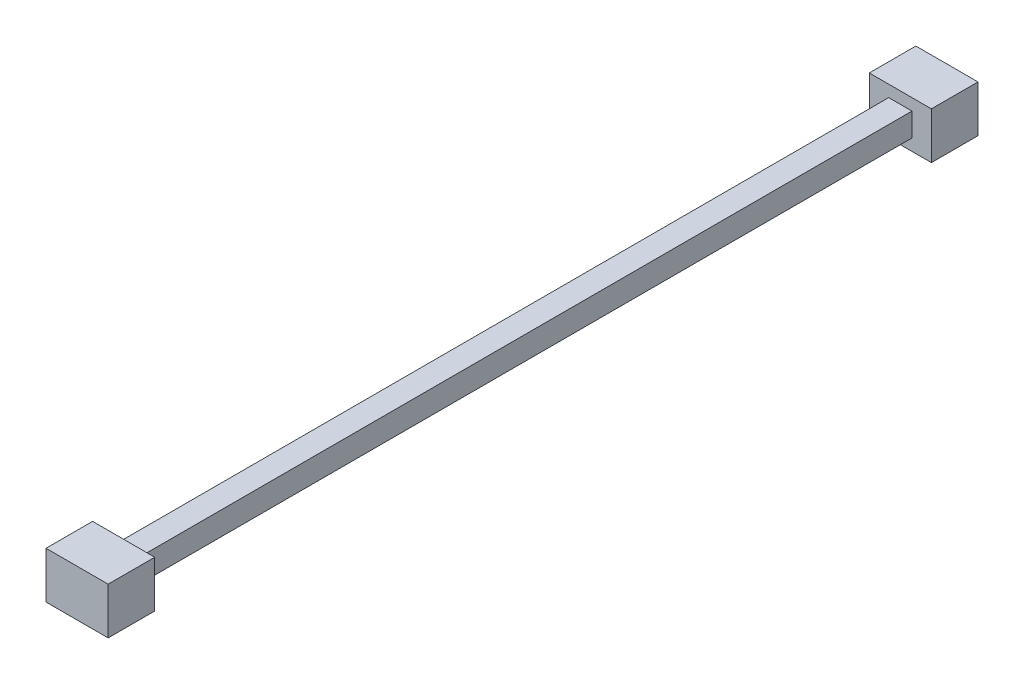
ISO-10303-21;
HEADER;
FILE_DESCRIPTION(('STEP AP214'),'2;1');
FILE_NAME('part.step','',(''),(''),'','','');
FILE_SCHEMA(('AUTOMOTIVE_DESIGN { 1 0 10303 214 1 1 1 1 }'));
ENDSEC;
DATA;
#1=APPLICATION_CONTEXT('core data for automotive mechanical design processes');
#2=APPLICATION_PROTOCOL_DEFINITION('international standard','automotive_design',2000,#1);
#3=PRODUCT_CONTEXT('',#1,'mechanical');
#4=PRODUCT('Part','Part','',(#3));
#5=PRODUCT_RELATED_PRODUCT_CATEGORY('part','',(#4));
#6=PRODUCT_DEFINITION_FORMATION('','',#4);
#7=PRODUCT_DEFINITION_CONTEXT('part definition',#1,'design');
#8=PRODUCT_DEFINITION('design','',#6,#7);
#9=PRODUCT_DEFINITION_SHAPE('','',#8);
#10=(LENGTH_UNIT() NAMED_UNIT(*) SI_UNIT(.MILLI.,.METRE.));
#11=(NAMED_UNIT(*) PLANE_ANGLE_UNIT() SI_UNIT($,.RADIAN.));
#12=(NAMED_UNIT(*) SI_UNIT($,.STERADIAN.) SOLID_ANGLE_UNIT());
#13=UNCERTAINTY_MEASURE_WITH_UNIT(LENGTH_MEASURE(1.E-05),#10,'distance_accuracy_value','');
#14=(GEOMETRIC_REPRESENTATION_CONTEXT(3) GLOBAL_UNCERTAINTY_ASSIGNED_CONTEXT((#13)) GLOBAL_UNIT_ASSIGNED_CONTEXT((#10,
#11,#12)) REPRESENTATION_CONTEXT('',''));
#15=CARTESIAN_POINT('',(0.,0.,0.));
#16=DIRECTION('',(0.,0.,1.));
#17=DIRECTION('',(1.,0.,0.));
#18=AXIS2_PLACEMENT_3D('',#15,#16,#17);
#19=CARTESIAN_POINT('',(7.5,-7.5,500.));
#20=DIRECTION('',(-1.,0.,0.));
#21=DIRECTION('',(0.,0.,1.));
#22=AXIS2_PLACEMENT_3D('',#19,#20,#21);
#23=PLANE('',#22);
#24=DIRECTION('',(0.,1.,0.));
#25=VECTOR('',#24,1.);
#26=CARTESIAN_POINT('',(7.5,-7.5,0.));
#27=LINE('',#26,#25);
#28=CARTESIAN_POINT('',(7.5,-7.5,0.));
#29=VERTEX_POINT('',#28);
#30=CARTESIAN_POINT('',(7.5,7.5,0.));
#31=VERTEX_POINT('',#30);
#32=EDGE_CURVE('E182',#29,#31,#27,.T.);
#33=ORIENTED_EDGE('',*,*,#32,.T.);
#34=DIRECTION('',(0.,0.,-1.));
#35=VECTOR('',#34,1.);
#36=CARTESIAN_POINT('',(7.5,7.5,500.));
#37=LINE('',#36,#35);
#38=CARTESIAN_POINT('',(7.5,7.5,500.));
#39=VERTEX_POINT('',#38);
#40=EDGE_CURVE('E11',#39,#31,#37,.T.);
#41=ORIENTED_EDGE('',*,*,#40,.F.);
#42=DIRECTION('',(0.,1.,0.));
#43=VECTOR('',#42,1.);
#44=CARTESIAN_POINT('',(7.5,-7.5,500.));
#45=LINE('',#44,#43);
#46=CARTESIAN_POINT('',(7.5,-7.5,500.));
#47=VERTEX_POINT('',#46);
#48=EDGE_CURVE('E183',#47,#39,#45,.T.);
#49=ORIENTED_EDGE('',*,*,#48,.F.);
#50=DIRECTION('',(0.,0.,-1.));
#51=VECTOR('',#50,1.);
#52=CARTESIAN_POINT('',(7.5,-7.5,500.));
#53=LINE('',#52,#51);
#54=EDGE_CURVE('E196',#47,#29,#53,.T.);
#55=ORIENTED_EDGE('',*,*,#54,.T.);
#56=EDGE_LOOP('',(#33,#41,#49,#55));
#57=FACE_BOUND('',#56,.T.);
#58=ADVANCED_FACE('F37',(#57),#23,.F.);
#59=CARTESIAN_POINT('',(-7.5,7.5,500.));
#60=DIRECTION('',(0.,-1.,0.));
#61=DIRECTION('',(0.,0.,-1.));
#62=AXIS2_PLACEMENT_3D('',#59,#60,#61);
#63=PLANE('',#62);
#64=DIRECTION('',(-1.,0.,0.));
#65=VECTOR('',#64,1.);
#66=CARTESIAN_POINT('',(-7.5,7.5,0.));
#67=LINE('',#66,#65);
#68=CARTESIAN_POINT('',(-7.5,7.5,0.));
#69=VERTEX_POINT('',#68);
#70=EDGE_CURVE('E199',#31,#69,#67,.T.);
#71=ORIENTED_EDGE('',*,*,#70,.T.);
#72=DIRECTION('',(0.,0.,-1.));
#73=VECTOR('',#72,1.);
#74=CARTESIAN_POINT('',(-7.5,7.5,500.));
#75=LINE('',#74,#73);
#76=CARTESIAN_POINT('',(-7.5,7.5,500.));
#77=VERTEX_POINT('',#76);
#78=EDGE_CURVE('E45',#77,#69,#75,.T.);
#79=ORIENTED_EDGE('',*,*,#78,.F.);
#80=DIRECTION('',(-1.,0.,0.));
#81=VECTOR('',#80,1.);
#82=CARTESIAN_POINT('',(-7.5,7.5,500.));
#83=LINE('',#82,#81);
#84=EDGE_CURVE('E186',#39,#77,#83,.T.);
#85=ORIENTED_EDGE('',*,*,#84,.F.);
#86=ORIENTED_EDGE('',*,*,#40,.T.);
#87=EDGE_LOOP('',(#71,#79,#85,#86));
#88=FACE_BOUND('',#87,.T.);
#89=ADVANCED_FACE('F212',(#88),#63,.F.);
#90=CARTESIAN_POINT('',(-7.5,-7.5,500.));
#91=DIRECTION('',(1.,0.,0.));
#92=DIRECTION('',(0.,0.,-1.));
#93=AXIS2_PLACEMENT_3D('',#90,#91,#92);
#94=PLANE('',#93);
#95=DIRECTION('',(0.,-1.,0.));
#96=VECTOR('',#95,1.);
#97=CARTESIAN_POINT('',(-7.5,-7.5,0.));
#98=LINE('',#97,#96);
#99=CARTESIAN_POINT('',(-7.5,-7.5,0.));
#100=VERTEX_POINT('',#99);
#101=EDGE_CURVE('E202',#69,#100,#98,.T.);
#102=ORIENTED_EDGE('',*,*,#101,.T.);
#103=DIRECTION('',(0.,0.,-1.));
#104=VECTOR('',#103,1.);
#105=CARTESIAN_POINT('',(-7.5,-7.5,500.));
#106=LINE('',#105,#104);
#107=CARTESIAN_POINT('',(-7.5,-7.5,500.));
#108=VERTEX_POINT('',#107);
#109=EDGE_CURVE('E52',#108,#100,#106,.T.);
#110=ORIENTED_EDGE('',*,*,#109,.F.);
#111=DIRECTION('',(0.,-1.,0.));
#112=VECTOR('',#111,1.);
#113=CARTESIAN_POINT('',(-7.5,-7.5,500.));
#114=LINE('',#113,#112);
#115=EDGE_CURVE('E190',#77,#108,#114,.T.);
#116=ORIENTED_EDGE('',*,*,#115,.F.);
#117=ORIENTED_EDGE('',*,*,#78,.T.);
#118=EDGE_LOOP('',(#102,#110,#116,#117));
#119=FACE_BOUND('',#118,.T.);
#120=ADVANCED_FACE('F209',(#119),#94,.F.);
#121=CARTESIAN_POINT('',(-7.5,-7.5,500.));
#122=DIRECTION('',(0.,1.,0.));
#123=DIRECTION('',(0.,0.,1.));
#124=AXIS2_PLACEMENT_3D('',#121,#122,#123);
#125=PLANE('',#124);
#126=DIRECTION('',(1.,0.,0.));
#127=VECTOR('',#126,1.);
#128=CARTESIAN_POINT('',(-7.5,-7.5,0.));
#129=LINE('',#128,#127);
#130=EDGE_CURVE('E187',#100,#29,#129,.T.);
#131=ORIENTED_EDGE('',*,*,#130,.T.);
#132=ORIENTED_EDGE('',*,*,#54,.F.);
#133=DIRECTION('',(1.,0.,0.));
#134=VECTOR('',#133,1.);
#135=CARTESIAN_POINT('',(-7.5,-7.5,500.));
#136=LINE('',#135,#134);
#137=EDGE_CURVE('E193',#108,#47,#136,.T.);
#138=ORIENTED_EDGE('',*,*,#137,.F.);
#139=ORIENTED_EDGE('',*,*,#109,.T.);
#140=EDGE_LOOP('',(#131,#132,#138,#139));
#141=FACE_BOUND('',#140,.T.);
#142=ADVANCED_FACE('F219',(#141),#125,.F.);
#143=CARTESIAN_POINT('',(20.,-15.,530.));
#144=DIRECTION('',(-1.,0.,0.));
#145=DIRECTION('',(0.,0.,1.));
#146=AXIS2_PLACEMENT_3D('',#143,#144,#145);
#147=PLANE('',#146);
#148=DIRECTION('',(0.,1.,0.));
#149=VECTOR('',#148,1.);
#150=CARTESIAN_POINT('',(20.,-15.,500.));
#151=LINE('',#150,#149);
#152=CARTESIAN_POINT('',(20.,-15.,500.));
#153=VERTEX_POINT('',#152);
#154=CARTESIAN_POINT('',(20.,15.,500.));
#155=VERTEX_POINT('',#154);
#156=EDGE_CURVE('E147',#153,#155,#151,.T.);
#157=ORIENTED_EDGE('',*,*,#156,.T.);
#158=DIRECTION('',(0.,0.,-1.));
#159=VECTOR('',#158,1.);
#160=CARTESIAN_POINT('',(20.,15.,530.));
#161=LINE('',#160,#159);
#162=CARTESIAN_POINT('',(20.,15.,530.));
#163=VERTEX_POINT('',#162);
#164=EDGE_CURVE('E179',#163,#155,#161,.T.);
#165=ORIENTED_EDGE('',*,*,#164,.F.);
#166=DIRECTION('',(0.,1.,0.));
#167=VECTOR('',#166,1.);
#168=CARTESIAN_POINT('',(20.,-15.,530.));
#169=LINE('',#168,#167);
#170=CARTESIAN_POINT('',(20.,-15.,530.));
#171=VERTEX_POINT('',#170);
#172=EDGE_CURVE('E156',#171,#163,#169,.T.);
#173=ORIENTED_EDGE('',*,*,#172,.F.);
#174=DIRECTION('',(0.,0.,-1.));
#175=VECTOR('',#174,1.);
#176=CARTESIAN_POINT('',(20.,-15.,530.));
#177=LINE('',#176,#175);
#178=EDGE_CURVE('E165',#171,#153,#177,.T.);
#179=ORIENTED_EDGE('',*,*,#178,.T.);
#180=EDGE_LOOP('',(#157,#165,#173,#179));
#181=FACE_BOUND('',#180,.T.);
#182=ADVANCED_FACE('F232',(#181),#147,.F.);
#183=CARTESIAN_POINT('',(-20.,15.,530.));
#184=DIRECTION('',(0.,-1.,0.));
#185=DIRECTION('',(0.,0.,-1.));
#186=AXIS2_PLACEMENT_3D('',#183,#184,#185);
#187=PLANE('',#186);
#188=DIRECTION('',(-1.,0.,0.));
#189=VECTOR('',#188,1.);
#190=CARTESIAN_POINT('',(-20.,15.,500.));
#191=LINE('',#190,#189);
#192=CARTESIAN_POINT('',(-20.,15.,500.));
#193=VERTEX_POINT('',#192);
#194=EDGE_CURVE('E150',#155,#193,#191,.T.);
#195=ORIENTED_EDGE('',*,*,#194,.T.);
#196=DIRECTION('',(0.,0.,-1.));
#197=VECTOR('',#196,1.);
#198=CARTESIAN_POINT('',(-20.,15.,530.));
#199=LINE('',#198,#197);
#200=CARTESIAN_POINT('',(-20.,15.,530.));
#201=VERTEX_POINT('',#200);
#202=EDGE_CURVE('E176',#201,#193,#199,.T.);
#203=ORIENTED_EDGE('',*,*,#202,.F.);
#204=DIRECTION('',(-1.,0.,0.));
#205=VECTOR('',#204,1.);
#206=CARTESIAN_POINT('',(-20.,15.,530.));
#207=LINE('',#206,#205);
#208=EDGE_CURVE('E159',#163,#201,#207,.T.);
#209=ORIENTED_EDGE('',*,*,#208,.F.);
#210=ORIENTED_EDGE('',*,*,#164,.T.);
#211=EDGE_LOOP('',(#195,#203,#209,#210));
#212=FACE_BOUND('',#211,.T.);
#213=ADVANCED_FACE('F244',(#212),#187,.F.);
#214=CARTESIAN_POINT('',(-20.,-15.,530.));
#215=DIRECTION('',(1.,0.,0.));
#216=DIRECTION('',(0.,0.,-1.));
#217=AXIS2_PLACEMENT_3D('',#214,#215,#216);
#218=PLANE('',#217);
#219=DIRECTION('',(0.,-1.,0.));
#220=VECTOR('',#219,1.);
#221=CARTESIAN_POINT('',(-20.,-15.,500.));
#222=LINE('',#221,#220);
#223=CARTESIAN_POINT('',(-20.,-15.,500.));
#224=VERTEX_POINT('',#223);
#225=EDGE_CURVE('E168',#193,#224,#222,.T.);
#226=ORIENTED_EDGE('',*,*,#225,.T.);
#227=DIRECTION('',(0.,0.,-1.));
#228=VECTOR('',#227,1.);
#229=CARTESIAN_POINT('',(-20.,-15.,530.));
#230=LINE('',#229,#228);
#231=CARTESIAN_POINT('',(-20.,-15.,530.));
#232=VERTEX_POINT('',#231);
#233=EDGE_CURVE('E173',#232,#224,#230,.T.);
#234=ORIENTED_EDGE('',*,*,#233,.F.);
#235=DIRECTION('',(0.,-1.,0.));
#236=VECTOR('',#235,1.);
#237=CARTESIAN_POINT('',(-20.,-15.,530.));
#238=LINE('',#237,#236);
#239=EDGE_CURVE('E162',#201,#232,#238,.T.);
#240=ORIENTED_EDGE('',*,*,#239,.F.);
#241=ORIENTED_EDGE('',*,*,#202,.T.);
#242=EDGE_LOOP('',(#226,#234,#240,#241));
#243=FACE_BOUND('',#242,.T.);
#244=ADVANCED_FACE('F241',(#243),#218,.F.);
#245=CARTESIAN_POINT('',(-20.,-15.,530.));
#246=DIRECTION('',(0.,1.,0.));
#247=DIRECTION('',(0.,0.,1.));
#248=AXIS2_PLACEMENT_3D('',#245,#246,#247);
#249=PLANE('',#248);
#250=DIRECTION('',(1.,0.,0.));
#251=VECTOR('',#250,1.);
#252=CARTESIAN_POINT('',(-20.,-15.,500.));
#253=LINE('',#252,#251);
#254=EDGE_CURVE('E160',#224,#153,#253,.T.);
#255=ORIENTED_EDGE('',*,*,#254,.T.);
#256=ORIENTED_EDGE('',*,*,#178,.F.);
#257=DIRECTION('',(1.,0.,0.));
#258=VECTOR('',#257,1.);
#259=CARTESIAN_POINT('',(-20.,-15.,530.));
#260=LINE('',#259,#258);
#261=EDGE_CURVE('E164',#232,#171,#260,.T.);
#262=ORIENTED_EDGE('',*,*,#261,.F.);
#263=ORIENTED_EDGE('',*,*,#233,.T.);
#264=EDGE_LOOP('',(#255,#256,#262,#263));
#265=FACE_BOUND('',#264,.T.);
#266=ADVANCED_FACE('F237',(#265),#249,.F.);
#267=CARTESIAN_POINT('',(0.,0.,530.));
#268=DIRECTION('',(0.,0.,-1.));
#269=DIRECTION('',(-1.,0.,0.));
#270=AXIS2_PLACEMENT_3D('',#267,#268,#269);
#271=PLANE('',#270);
#272=ORIENTED_EDGE('',*,*,#172,.T.);
#273=ORIENTED_EDGE('',*,*,#208,.T.);
#274=ORIENTED_EDGE('',*,*,#239,.T.);
#275=ORIENTED_EDGE('',*,*,#261,.T.);
#276=EDGE_LOOP('',(#272,#273,#274,#275));
#277=FACE_BOUND('',#276,.T.);
#278=ADVANCED_FACE('F225',(#277),#271,.F.);
#279=CARTESIAN_POINT('',(0.,0.,500.));
#280=DIRECTION('',(0.,0.,-1.));
#281=DIRECTION('',(-1.,0.,0.));
#282=AXIS2_PLACEMENT_3D('',#279,#280,#281);
#283=PLANE('',#282);
#284=ORIENTED_EDGE('',*,*,#137,.T.);
#285=ORIENTED_EDGE('',*,*,#48,.T.);
#286=ORIENTED_EDGE('',*,*,#84,.T.);
#287=ORIENTED_EDGE('',*,*,#115,.T.);
#288=EDGE_LOOP('',(#284,#285,#286,#287));
#289=FACE_BOUND('',#288,.T.);
#290=ORIENTED_EDGE('',*,*,#156,.F.);
#291=ORIENTED_EDGE('',*,*,#254,.F.);
#292=ORIENTED_EDGE('',*,*,#225,.F.);
#293=ORIENTED_EDGE('',*,*,#194,.F.);
#294=EDGE_LOOP('',(#290,#291,#292,#293));
#295=FACE_BOUND('',#294,.T.);
#296=ADVANCED_FACE('F222',(#289,#295),#283,.T.);
#297=CARTESIAN_POINT('',(-20.,15.,-30.));
#298=DIRECTION('',(1.,0.,0.));
#299=DIRECTION('',(0.,1.,0.));
#300=AXIS2_PLACEMENT_3D('',#297,#298,#299);
#301=PLANE('',#300);
#302=DIRECTION('',(0.,1.,0.));
#303=VECTOR('',#302,1.);
#304=CARTESIAN_POINT('',(-20.,15.,0.));
#305=LINE('',#304,#303);
#306=CARTESIAN_POINT('',(-20.,-15.,0.));
#307=VERTEX_POINT('',#306);
#308=CARTESIAN_POINT('',(-20.,15.,0.));
#309=VERTEX_POINT('',#308);
#310=EDGE_CURVE('E146',#307,#309,#305,.T.);
#311=ORIENTED_EDGE('',*,*,#310,.T.);
#312=DIRECTION('',(0.,0.,1.));
#313=VECTOR('',#312,1.);
#314=CARTESIAN_POINT('',(-20.,15.,-30.));
#315=LINE('',#314,#313);
#316=CARTESIAN_POINT('',(-20.,15.,-30.));
#317=VERTEX_POINT('',#316);
#318=EDGE_CURVE('E126',#317,#309,#315,.T.);
#319=ORIENTED_EDGE('',*,*,#318,.F.);
#320=DIRECTION('',(0.,1.,0.));
#321=VECTOR('',#320,1.);
#322=CARTESIAN_POINT('',(-20.,15.,-30.));
#323=LINE('',#322,#321);
#324=CARTESIAN_POINT('',(-20.,-15.,-30.));
#325=VERTEX_POINT('',#324);
#326=EDGE_CURVE('E133',#325,#317,#323,.T.);
#327=ORIENTED_EDGE('',*,*,#326,.F.);
#328=DIRECTION('',(0.,0.,1.));
#329=VECTOR('',#328,1.);
#330=CARTESIAN_POINT('',(-20.,-15.,-30.));
#331=LINE('',#330,#329);
#332=EDGE_CURVE('E367',#325,#307,#331,.T.);
#333=ORIENTED_EDGE('',*,*,#332,.T.);
#334=EDGE_LOOP('',(#311,#319,#327,#333));
#335=FACE_BOUND('',#334,.T.);
#336=ADVANCED_FACE('F144',(#335),#301,.F.);
#337=CARTESIAN_POINT('',(20.,15.,-30.));
#338=DIRECTION('',(0.,-1.,0.));
#339=DIRECTION('',(0.,0.,-1.));
#340=AXIS2_PLACEMENT_3D('',#337,#338,#339);
#341=PLANE('',#340);
#342=DIRECTION('',(1.,0.,0.));
#343=VECTOR('',#342,1.);
#344=CARTESIAN_POINT('',(20.,15.,0.));
#345=LINE('',#344,#343);
#346=CARTESIAN_POINT('',(20.,15.,0.));
#347=VERTEX_POINT('',#346);
#348=EDGE_CURVE('E373',#309,#347,#345,.T.);
#349=ORIENTED_EDGE('',*,*,#348,.T.);
#350=DIRECTION('',(0.,0.,1.));
#351=VECTOR('',#350,1.);
#352=CARTESIAN_POINT('',(20.,15.,-30.));
#353=LINE('',#352,#351);
#354=CARTESIAN_POINT('',(20.,15.,-30.));
#355=VERTEX_POINT('',#354);
#356=EDGE_CURVE('E129',#355,#347,#353,.T.);
#357=ORIENTED_EDGE('',*,*,#356,.F.);
#358=DIRECTION('',(1.,0.,0.));
#359=VECTOR('',#358,1.);
#360=CARTESIAN_POINT('',(20.,15.,-30.));
#361=LINE('',#360,#359);
#362=EDGE_CURVE('E122',#317,#355,#361,.T.);
#363=ORIENTED_EDGE('',*,*,#362,.F.);
#364=ORIENTED_EDGE('',*,*,#318,.T.);
#365=EDGE_LOOP('',(#349,#357,#363,#364));
#366=FACE_BOUND('',#365,.T.);
#367=ADVANCED_FACE('F124',(#366),#341,.F.);
#368=CARTESIAN_POINT('',(20.,15.,-30.));
#369=DIRECTION('',(-1.,0.,0.));
#370=DIRECTION('',(0.,-1.,0.));
#371=AXIS2_PLACEMENT_3D('',#368,#369,#370);
#372=PLANE('',#371);
#373=DIRECTION('',(0.,-1.,0.));
#374=VECTOR('',#373,1.);
#375=CARTESIAN_POINT('',(20.,15.,0.));
#376=LINE('',#375,#374);
#377=CARTESIAN_POINT('',(20.,-15.,0.));
#378=VERTEX_POINT('',#377);
#379=EDGE_CURVE('E370',#347,#378,#376,.T.);
#380=ORIENTED_EDGE('',*,*,#379,.T.);
#381=DIRECTION('',(0.,0.,1.));
#382=VECTOR('',#381,1.);
#383=CARTESIAN_POINT('',(20.,-15.,-30.));
#384=LINE('',#383,#382);
#385=CARTESIAN_POINT('',(20.,-15.,-30.));
#386=VERTEX_POINT('',#385);
#387=EDGE_CURVE('E152',#386,#378,#384,.T.);
#388=ORIENTED_EDGE('',*,*,#387,.F.);
#389=DIRECTION('',(0.,-1.,0.));
#390=VECTOR('',#389,1.);
#391=CARTESIAN_POINT('',(20.,15.,-30.));
#392=LINE('',#391,#390);
#393=EDGE_CURVE('E132',#355,#386,#392,.T.);
#394=ORIENTED_EDGE('',*,*,#393,.F.);
#395=ORIENTED_EDGE('',*,*,#356,.T.);
#396=EDGE_LOOP('',(#380,#388,#394,#395));
#397=FACE_BOUND('',#396,.T.);
#398=ADVANCED_FACE('F326',(#397),#372,.F.);
#399=CARTESIAN_POINT('',(20.,-15.,-30.));
#400=DIRECTION('',(0.,1.,0.));
#401=DIRECTION('',(0.,0.,1.));
#402=AXIS2_PLACEMENT_3D('',#399,#400,#401);
#403=PLANE('',#402);
#404=DIRECTION('',(-1.,0.,0.));
#405=VECTOR('',#404,1.);
#406=CARTESIAN_POINT('',(20.,-15.,0.));
#407=LINE('',#406,#405);
#408=EDGE_CURVE('E142',#378,#307,#407,.T.);
#409=ORIENTED_EDGE('',*,*,#408,.T.);
#410=ORIENTED_EDGE('',*,*,#332,.F.);
#411=DIRECTION('',(-1.,0.,0.));
#412=VECTOR('',#411,1.);
#413=CARTESIAN_POINT('',(20.,-15.,-30.));
#414=LINE('',#413,#412);
#415=EDGE_CURVE('E138',#386,#325,#414,.T.);
#416=ORIENTED_EDGE('',*,*,#415,.F.);
#417=ORIENTED_EDGE('',*,*,#387,.T.);
#418=EDGE_LOOP('',(#409,#410,#416,#417));
#419=FACE_BOUND('',#418,.T.);
#420=ADVANCED_FACE('F335',(#419),#403,.F.);
#421=CARTESIAN_POINT('',(0.,0.,-30.));
#422=DIRECTION('',(0.,0.,-1.));
#423=DIRECTION('',(-1.,0.,0.));
#424=AXIS2_PLACEMENT_3D('',#421,#422,#423);
#425=PLANE('',#424);
#426=ORIENTED_EDGE('',*,*,#326,.T.);
#427=ORIENTED_EDGE('',*,*,#362,.T.);
#428=ORIENTED_EDGE('',*,*,#393,.T.);
#429=ORIENTED_EDGE('',*,*,#415,.T.);
#430=EDGE_LOOP('',(#426,#427,#428,#429));
#431=FACE_BOUND('',#430,.T.);
#432=ADVANCED_FACE('F136',(#431),#425,.T.);
#433=CARTESIAN_POINT('',(0.,0.,0.));
#434=DIRECTION('',(0.,0.,-1.));
#435=DIRECTION('',(-1.,0.,0.));
#436=AXIS2_PLACEMENT_3D('',#433,#434,#435);
#437=PLANE('',#436);
#438=ORIENTED_EDGE('',*,*,#32,.F.);
#439=ORIENTED_EDGE('',*,*,#130,.F.);
#440=ORIENTED_EDGE('',*,*,#101,.F.);
#441=ORIENTED_EDGE('',*,*,#70,.F.);
#442=EDGE_LOOP('',(#438,#439,#440,#441));
#443=FACE_BOUND('',#442,.T.);
#444=ORIENTED_EDGE('',*,*,#310,.F.);
#445=ORIENTED_EDGE('',*,*,#408,.F.);
#446=ORIENTED_EDGE('',*,*,#379,.F.);
#447=ORIENTED_EDGE('',*,*,#348,.F.);
#448=EDGE_LOOP('',(#444,#445,#446,#447));
#449=FACE_BOUND('',#448,.T.);
#450=ADVANCED_FACE('F215',(#443,#449),#437,.F.);
#451=CLOSED_SHELL('',(#58,#89,#120,#142,#182,#213,#244,#266,#278,#296,#336,#367,#398,#420,#432,#450));
#452=MANIFOLD_SOLID_BREP('B2',#451);
#453=ADVANCED_BREP_SHAPE_REPRESENTATION('',(#18,#452),#14);
#454=SHAPE_DEFINITION_REPRESENTATION(#9,#453);
ENDSEC;
END-ISO-10303-21;
